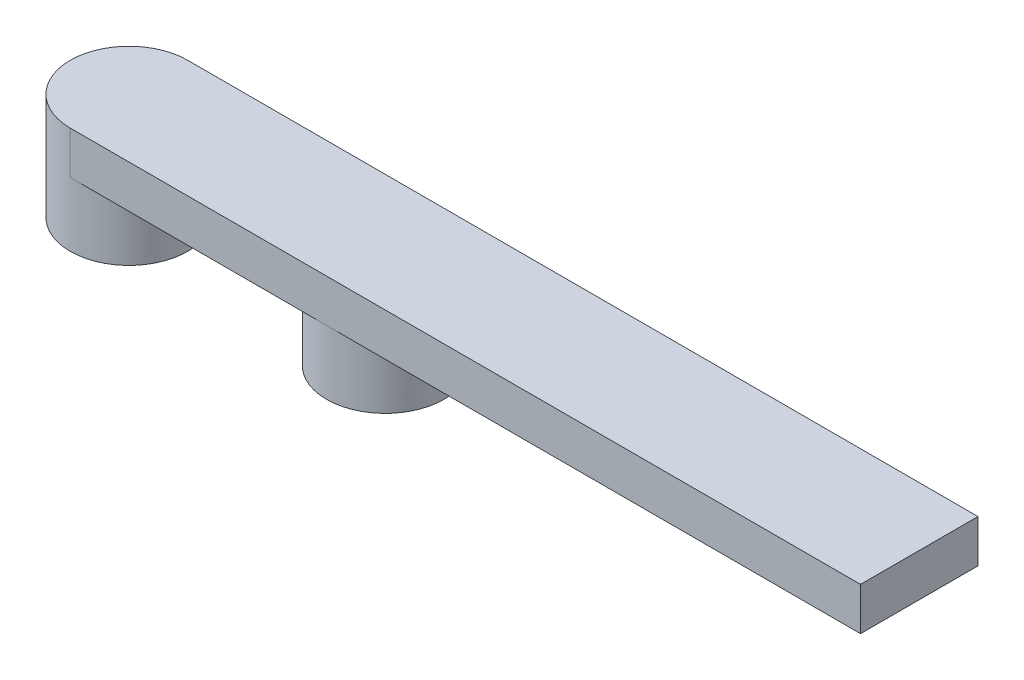
ISO-10303-21;
HEADER;
FILE_DESCRIPTION(('STEP AP214'),'2;1');
FILE_NAME('part.step','',(''),(''),'','','');
FILE_SCHEMA(('AUTOMOTIVE_DESIGN { 1 0 10303 214 1 1 1 1 }'));
ENDSEC;
DATA;
#1=APPLICATION_CONTEXT('core data for automotive mechanical design processes');
#2=APPLICATION_PROTOCOL_DEFINITION('international standard','automotive_design',2000,#1);
#3=PRODUCT_CONTEXT('',#1,'mechanical');
#4=PRODUCT('Part','Part','',(#3));
#5=PRODUCT_RELATED_PRODUCT_CATEGORY('part','',(#4));
#6=PRODUCT_DEFINITION_FORMATION('','',#4);
#7=PRODUCT_DEFINITION_CONTEXT('part definition',#1,'design');
#8=PRODUCT_DEFINITION('design','',#6,#7);
#9=PRODUCT_DEFINITION_SHAPE('','',#8);
#10=(LENGTH_UNIT() NAMED_UNIT(*) SI_UNIT(.MILLI.,.METRE.));
#11=(NAMED_UNIT(*) PLANE_ANGLE_UNIT() SI_UNIT($,.RADIAN.));
#12=(NAMED_UNIT(*) SI_UNIT($,.STERADIAN.) SOLID_ANGLE_UNIT());
#13=UNCERTAINTY_MEASURE_WITH_UNIT(LENGTH_MEASURE(1.E-05),#10,'distance_accuracy_value','');
#14=(GEOMETRIC_REPRESENTATION_CONTEXT(3) GLOBAL_UNCERTAINTY_ASSIGNED_CONTEXT((#13)) GLOBAL_UNIT_ASSIGNED_CONTEXT((#10,
#11,#12)) REPRESENTATION_CONTEXT('',''));
#15=CARTESIAN_POINT('',(0.,0.,0.));
#16=DIRECTION('',(0.,0.,1.));
#17=DIRECTION('',(1.,0.,0.));
#18=AXIS2_PLACEMENT_3D('',#15,#16,#17);
#19=CARTESIAN_POINT('',(0.,0.,0.));
#20=DIRECTION('',(0.,1.,0.));
#21=DIRECTION('',(0.,0.,1.));
#22=AXIS2_PLACEMENT_3D('',#19,#20,#21);
#23=PLANE('',#22);
#24=DIRECTION('',(1.,0.,0.));
#25=VECTOR('',#24,1.);
#26=CARTESIAN_POINT('',(0.,0.,2.75));
#27=LINE('',#26,#25);
#28=CARTESIAN_POINT('',(12.,0.,2.75));
#29=VERTEX_POINT('',#28);
#30=CARTESIAN_POINT('',(37.,0.,2.75));
#31=VERTEX_POINT('',#30);
#32=EDGE_CURVE('E135',#29,#31,#27,.T.);
#33=ORIENTED_EDGE('',*,*,#32,.F.);
#34=CARTESIAN_POINT('',(12.,0.,0.));
#35=DIRECTION('',(0.,1.,0.));
#36=DIRECTION('',(0.,0.,1.));
#37=AXIS2_PLACEMENT_3D('',#34,#35,#36);
#38=CIRCLE('',#37,2.75);
#39=CARTESIAN_POINT('',(12.,0.,-2.74999999999998));
#40=VERTEX_POINT('',#39);
#41=EDGE_CURVE('E82',#29,#40,#38,.T.);
#42=ORIENTED_EDGE('',*,*,#41,.T.);
#43=DIRECTION('',(-1.,0.,0.));
#44=VECTOR('',#43,1.);
#45=CARTESIAN_POINT('',(0.,0.,-2.74999999999998));
#46=LINE('',#45,#44);
#47=CARTESIAN_POINT('',(37.,0.,-2.75));
#48=VERTEX_POINT('',#47);
#49=EDGE_CURVE('E109',#48,#40,#46,.T.);
#50=ORIENTED_EDGE('',*,*,#49,.F.);
#51=DIRECTION('',(0.,0.,1.));
#52=VECTOR('',#51,1.);
#53=CARTESIAN_POINT('',(37.,0.,-2.75));
#54=LINE('',#53,#52);
#55=EDGE_CURVE('E113',#48,#31,#54,.T.);
#56=ORIENTED_EDGE('',*,*,#55,.T.);
#57=EDGE_LOOP('',(#33,#42,#50,#56));
#58=FACE_BOUND('',#57,.T.);
#59=ADVANCED_FACE('F65',(#58),#23,.F.);
#60=CARTESIAN_POINT('',(0.,0.,-2.75));
#61=VERTEX_POINT('',#60);
#62=EDGE_CURVE('E120',#40,#61,#46,.T.);
#63=ORIENTED_EDGE('',*,*,#62,.F.);
#64=EDGE_CURVE('E170',#40,#29,#38,.T.);
#65=ORIENTED_EDGE('',*,*,#64,.T.);
#66=CARTESIAN_POINT('',(0.,0.,2.75));
#67=VERTEX_POINT('',#66);
#68=EDGE_CURVE('E140',#67,#29,#27,.T.);
#69=ORIENTED_EDGE('',*,*,#68,.F.);
#70=CARTESIAN_POINT('',(0.,0.,0.));
#71=DIRECTION('',(0.,1.,0.));
#72=DIRECTION('',(0.,0.,1.));
#73=AXIS2_PLACEMENT_3D('',#70,#71,#72);
#74=CIRCLE('',#73,2.75);
#75=EDGE_CURVE('E143',#67,#61,#74,.T.);
#76=ORIENTED_EDGE('',*,*,#75,.T.);
#77=EDGE_LOOP('',(#63,#65,#69,#76));
#78=FACE_BOUND('',#77,.T.);
#79=ADVANCED_FACE('F186',(#78),#23,.F.);
#80=CARTESIAN_POINT('',(0.,2.,0.));
#81=DIRECTION('',(0.,-1.,0.));
#82=DIRECTION('',(0.,0.,-1.));
#83=AXIS2_PLACEMENT_3D('',#80,#81,#82);
#84=CYLINDRICAL_SURFACE('',#83,2.75);
#85=DIRECTION('',(0.,-1.,0.));
#86=VECTOR('',#85,1.);
#87=CARTESIAN_POINT('',(0.,2.,2.75));
#88=LINE('',#87,#86);
#89=CARTESIAN_POINT('',(0.,2.,2.75));
#90=VERTEX_POINT('',#89);
#91=EDGE_CURVE('E12',#90,#67,#88,.T.);
#92=ORIENTED_EDGE('',*,*,#91,.F.);
#93=CARTESIAN_POINT('',(0.,2.,0.));
#94=DIRECTION('',(0.,1.,0.));
#95=DIRECTION('',(0.,0.,1.));
#96=AXIS2_PLACEMENT_3D('',#93,#94,#95);
#97=CIRCLE('',#96,2.75);
#98=CARTESIAN_POINT('',(0.,2.,-2.74999999999999));
#99=VERTEX_POINT('',#98);
#100=EDGE_CURVE('E119',#99,#90,#97,.T.);
#101=ORIENTED_EDGE('',*,*,#100,.F.);
#102=DIRECTION('',(0.,-1.,0.));
#103=VECTOR('',#102,1.);
#104=CARTESIAN_POINT('',(0.,2.,-2.74999999999999));
#105=LINE('',#104,#103);
#106=EDGE_CURVE('E75',#99,#61,#105,.T.);
#107=ORIENTED_EDGE('',*,*,#106,.T.);
#108=ORIENTED_EDGE('',*,*,#75,.F.);
#109=EDGE_LOOP('',(#92,#101,#107,#108));
#110=FACE_BOUND('',#109,.T.);
#111=CARTESIAN_POINT('',(0.,-3.,0.));
#112=DIRECTION('',(0.,1.,0.));
#113=DIRECTION('',(0.,0.,1.));
#114=AXIS2_PLACEMENT_3D('',#111,#112,#113);
#115=CIRCLE('',#114,2.75);
#116=CARTESIAN_POINT('',(0.,-3.,2.75));
#117=VERTEX_POINT('',#116);
#118=EDGE_CURVE('E136',#117,#117,#115,.T.);
#119=ORIENTED_EDGE('',*,*,#118,.T.);
#120=EDGE_LOOP('',(#119));
#121=FACE_BOUND('',#120,.T.);
#122=ADVANCED_FACE('F188',(#110,#121),#84,.T.);
#123=CARTESIAN_POINT('',(0.,2.,-2.74999999999998));
#124=DIRECTION('',(0.,0.,1.));
#125=DIRECTION('',(1.,0.,0.));
#126=AXIS2_PLACEMENT_3D('',#123,#124,#125);
#127=PLANE('',#126);
#128=ORIENTED_EDGE('',*,*,#49,.T.);
#129=ORIENTED_EDGE('',*,*,#62,.T.);
#130=ORIENTED_EDGE('',*,*,#106,.F.);
#131=DIRECTION('',(-1.,0.,0.));
#132=VECTOR('',#131,1.);
#133=CARTESIAN_POINT('',(0.,2.,-2.74999999999998));
#134=LINE('',#133,#132);
#135=CARTESIAN_POINT('',(37.,2.,-2.75));
#136=VERTEX_POINT('',#135);
#137=EDGE_CURVE('E127',#136,#99,#134,.T.);
#138=ORIENTED_EDGE('',*,*,#137,.F.);
#139=DIRECTION('',(0.,-1.,0.));
#140=VECTOR('',#139,1.);
#141=CARTESIAN_POINT('',(37.,2.,-2.75));
#142=LINE('',#141,#140);
#143=EDGE_CURVE('E123',#136,#48,#142,.T.);
#144=ORIENTED_EDGE('',*,*,#143,.T.);
#145=EDGE_LOOP('',(#128,#129,#130,#138,#144));
#146=FACE_BOUND('',#145,.T.);
#147=ADVANCED_FACE('F124',(#146),#127,.F.);
#148=CARTESIAN_POINT('',(0.,2.,0.));
#149=DIRECTION('',(0.,1.,0.));
#150=DIRECTION('',(0.,0.,1.));
#151=AXIS2_PLACEMENT_3D('',#148,#149,#150);
#152=PLANE('',#151);
#153=ORIENTED_EDGE('',*,*,#100,.T.);
#154=DIRECTION('',(1.,0.,0.));
#155=VECTOR('',#154,1.);
#156=CARTESIAN_POINT('',(0.,2.,2.75));
#157=LINE('',#156,#155);
#158=CARTESIAN_POINT('',(37.,2.,2.75));
#159=VERTEX_POINT('',#158);
#160=EDGE_CURVE('E146',#90,#159,#157,.T.);
#161=ORIENTED_EDGE('',*,*,#160,.T.);
#162=DIRECTION('',(0.,0.,1.));
#163=VECTOR('',#162,1.);
#164=CARTESIAN_POINT('',(37.,2.,-2.75));
#165=LINE('',#164,#163);
#166=EDGE_CURVE('E150',#136,#159,#165,.T.);
#167=ORIENTED_EDGE('',*,*,#166,.F.);
#168=ORIENTED_EDGE('',*,*,#137,.T.);
#169=EDGE_LOOP('',(#153,#161,#167,#168));
#170=FACE_BOUND('',#169,.T.);
#171=ADVANCED_FACE('F200',(#170),#152,.T.);
#172=CARTESIAN_POINT('',(37.,2.,-2.75));
#173=DIRECTION('',(1.,0.,0.));
#174=DIRECTION('',(0.,0.,-1.));
#175=AXIS2_PLACEMENT_3D('',#172,#173,#174);
#176=PLANE('',#175);
#177=ORIENTED_EDGE('',*,*,#55,.F.);
#178=ORIENTED_EDGE('',*,*,#143,.F.);
#179=ORIENTED_EDGE('',*,*,#166,.T.);
#180=DIRECTION('',(0.,-1.,0.));
#181=VECTOR('',#180,1.);
#182=CARTESIAN_POINT('',(37.,2.,2.75));
#183=LINE('',#182,#181);
#184=EDGE_CURVE('E69',#159,#31,#183,.T.);
#185=ORIENTED_EDGE('',*,*,#184,.T.);
#186=EDGE_LOOP('',(#177,#178,#179,#185));
#187=FACE_BOUND('',#186,.T.);
#188=ADVANCED_FACE('F67',(#187),#176,.T.);
#189=CARTESIAN_POINT('',(0.,2.,2.75));
#190=DIRECTION('',(0.,0.,-1.));
#191=DIRECTION('',(-1.,0.,0.));
#192=AXIS2_PLACEMENT_3D('',#189,#190,#191);
#193=PLANE('',#192);
#194=ORIENTED_EDGE('',*,*,#184,.F.);
#195=ORIENTED_EDGE('',*,*,#160,.F.);
#196=ORIENTED_EDGE('',*,*,#91,.T.);
#197=ORIENTED_EDGE('',*,*,#68,.T.);
#198=ORIENTED_EDGE('',*,*,#32,.T.);
#199=EDGE_LOOP('',(#194,#195,#196,#197,#198));
#200=FACE_BOUND('',#199,.T.);
#201=ADVANCED_FACE('F202',(#200),#193,.F.);
#202=CARTESIAN_POINT('',(0.,-3.,0.));
#203=DIRECTION('',(0.,1.,0.));
#204=DIRECTION('',(0.,0.,1.));
#205=AXIS2_PLACEMENT_3D('',#202,#203,#204);
#206=PLANE('',#205);
#207=ORIENTED_EDGE('',*,*,#118,.F.);
#208=EDGE_LOOP('',(#207));
#209=FACE_BOUND('',#208,.T.);
#210=ADVANCED_FACE('F183',(#209),#206,.F.);
#211=CARTESIAN_POINT('',(12.,-3.,0.));
#212=DIRECTION('',(0.,1.,0.));
#213=DIRECTION('',(0.,0.,1.));
#214=AXIS2_PLACEMENT_3D('',#211,#212,#213);
#215=CYLINDRICAL_SURFACE('',#214,2.75);
#216=CARTESIAN_POINT('',(12.,-3.,0.));
#217=DIRECTION('',(0.,1.,0.));
#218=DIRECTION('',(0.,0.,1.));
#219=AXIS2_PLACEMENT_3D('',#216,#217,#218);
#220=CIRCLE('',#219,2.75);
#221=CARTESIAN_POINT('',(12.,-3.,2.75));
#222=VERTEX_POINT('',#221);
#223=EDGE_CURVE('E166',#222,#222,#220,.T.);
#224=ORIENTED_EDGE('',*,*,#223,.T.);
#225=EDGE_LOOP('',(#224));
#226=FACE_BOUND('',#225,.T.);
#227=ORIENTED_EDGE('',*,*,#41,.F.);
#228=ORIENTED_EDGE('',*,*,#64,.F.);
#229=EDGE_LOOP('',(#227,#228));
#230=FACE_BOUND('',#229,.T.);
#231=ADVANCED_FACE('F175',(#226,#230),#215,.T.);
#232=CARTESIAN_POINT('',(0.,-3.,0.));
#233=DIRECTION('',(0.,1.,0.));
#234=DIRECTION('',(0.,0.,1.));
#235=AXIS2_PLACEMENT_3D('',#232,#233,#234);
#236=PLANE('',#235);
#237=ORIENTED_EDGE('',*,*,#223,.F.);
#238=EDGE_LOOP('',(#237));
#239=FACE_BOUND('',#238,.T.);
#240=ADVANCED_FACE('F177',(#239),#236,.F.);
#241=CLOSED_SHELL('',(#59,#79,#122,#147,#171,#188,#201,#210,#231,#240));
#242=MANIFOLD_SOLID_BREP('B2',#241);
#243=ADVANCED_BREP_SHAPE_REPRESENTATION('',(#18,#242),#14);
#244=SHAPE_DEFINITION_REPRESENTATION(#9,#243);
ENDSEC;
END-ISO-10303-21;
